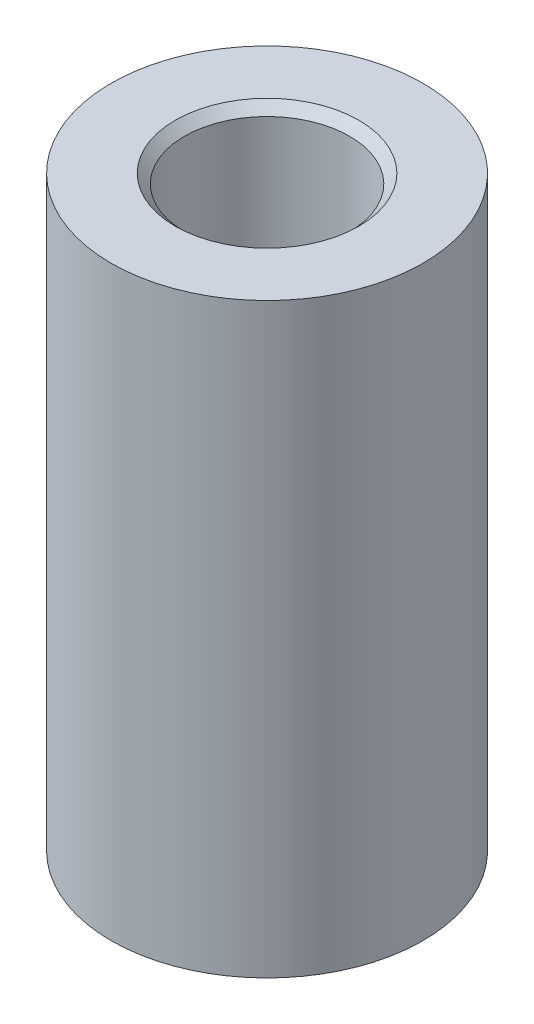
ISO-10303-21;
HEADER;
FILE_DESCRIPTION(('STEP AP214'),'2;1');
FILE_NAME('part.step','',(''),(''),'','','');
FILE_SCHEMA(('AUTOMOTIVE_DESIGN { 1 0 10303 214 1 1 1 1 }'));
ENDSEC;
DATA;
#1=APPLICATION_CONTEXT('core data for automotive mechanical design processes');
#2=APPLICATION_PROTOCOL_DEFINITION('international standard','automotive_design',2000,#1);
#3=PRODUCT_CONTEXT('',#1,'mechanical');
#4=PRODUCT('Part','Part','',(#3));
#5=PRODUCT_RELATED_PRODUCT_CATEGORY('part','',(#4));
#6=PRODUCT_DEFINITION_FORMATION('','',#4);
#7=PRODUCT_DEFINITION_CONTEXT('part definition',#1,'design');
#8=PRODUCT_DEFINITION('design','',#6,#7);
#9=PRODUCT_DEFINITION_SHAPE('','',#8);
#10=(LENGTH_UNIT() NAMED_UNIT(*) SI_UNIT(.MILLI.,.METRE.));
#11=(NAMED_UNIT(*) PLANE_ANGLE_UNIT() SI_UNIT($,.RADIAN.));
#12=(NAMED_UNIT(*) SI_UNIT($,.STERADIAN.) SOLID_ANGLE_UNIT());
#13=UNCERTAINTY_MEASURE_WITH_UNIT(LENGTH_MEASURE(1.E-05),#10,'distance_accuracy_value','');
#14=(GEOMETRIC_REPRESENTATION_CONTEXT(3) GLOBAL_UNCERTAINTY_ASSIGNED_CONTEXT((#13)) GLOBAL_UNIT_ASSIGNED_CONTEXT((#10,
#11,#12)) REPRESENTATION_CONTEXT('',''));
#15=CARTESIAN_POINT('',(0.,0.,0.));
#16=DIRECTION('',(0.,0.,1.));
#17=DIRECTION('',(1.,0.,0.));
#18=AXIS2_PLACEMENT_3D('',#15,#16,#17);
#19=CARTESIAN_POINT('',(-839.144552427114,25.4,-1451.42328364506));
#20=DIRECTION('',(0.,1.,0.));
#21=DIRECTION('',(0.,0.,1.));
#22=AXIS2_PLACEMENT_3D('',#19,#20,#21);
#23=PLANE('',#22);
#24=CARTESIAN_POINT('',(-839.144552427114,25.4,-1451.42328364506));
#25=DIRECTION('',(0.,1.,0.));
#26=DIRECTION('',(0.,0.,1.));
#27=AXIS2_PLACEMENT_3D('',#24,#25,#26);
#28=CIRCLE('',#27,3.97500000000006);
#29=CARTESIAN_POINT('',(-839.144552427114,25.4,-1447.44828364506));
#30=VERTEX_POINT('',#29);
#31=EDGE_CURVE('E10',#30,#30,#28,.F.);
#32=ORIENTED_EDGE('',*,*,#31,.T.);
#33=EDGE_LOOP('',(#32));
#34=FACE_BOUND('',#33,.T.);
#35=CARTESIAN_POINT('',(-839.144552427114,25.4,-1451.42328364506));
#36=DIRECTION('',(0.,1.,0.));
#37=DIRECTION('',(0.,0.,1.));
#38=AXIS2_PLACEMENT_3D('',#35,#36,#37);
#39=CIRCLE('',#38,6.75000000000003);
#40=CARTESIAN_POINT('',(-839.144552427114,25.4,-1444.67328364506));
#41=VERTEX_POINT('',#40);
#42=EDGE_CURVE('E51',#41,#41,#39,.T.);
#43=ORIENTED_EDGE('',*,*,#42,.T.);
#44=EDGE_LOOP('',(#43));
#45=FACE_BOUND('',#44,.T.);
#46=ADVANCED_FACE('F31',(#34,#45),#23,.T.);
#47=CARTESIAN_POINT('',(-839.144552427114,0.,-1451.42328364506));
#48=DIRECTION('',(0.,1.,0.));
#49=DIRECTION('',(0.,0.,1.));
#50=AXIS2_PLACEMENT_3D('',#47,#48,#49);
#51=PLANE('',#50);
#52=CARTESIAN_POINT('',(-839.144552427114,0.,-1451.42328364506));
#53=DIRECTION('',(0.,1.,0.));
#54=DIRECTION('',(0.,0.,1.));
#55=AXIS2_PLACEMENT_3D('',#52,#53,#54);
#56=CIRCLE('',#55,3.97500000000006);
#57=CARTESIAN_POINT('',(-839.144552427114,0.,-1447.44828364506));
#58=VERTEX_POINT('',#57);
#59=EDGE_CURVE('E46',#58,#58,#56,.T.);
#60=ORIENTED_EDGE('',*,*,#59,.T.);
#61=EDGE_LOOP('',(#60));
#62=FACE_BOUND('',#61,.T.);
#63=CARTESIAN_POINT('',(-839.144552427114,0.,-1451.42328364506));
#64=DIRECTION('',(0.,1.,0.));
#65=DIRECTION('',(0.,0.,1.));
#66=AXIS2_PLACEMENT_3D('',#63,#64,#65);
#67=CIRCLE('',#66,6.75000000000003);
#68=CARTESIAN_POINT('',(-839.144552427114,0.,-1444.67328364506));
#69=VERTEX_POINT('',#68);
#70=EDGE_CURVE('E52',#69,#69,#67,.T.);
#71=ORIENTED_EDGE('',*,*,#70,.F.);
#72=EDGE_LOOP('',(#71));
#73=FACE_BOUND('',#72,.T.);
#74=ADVANCED_FACE('F63',(#62,#73),#51,.F.);
#75=CARTESIAN_POINT('',(-839.144552427114,25.4,-1451.42328364506));
#76=DIRECTION('',(0.,-1.,0.));
#77=DIRECTION('',(0.,0.,-1.));
#78=AXIS2_PLACEMENT_3D('',#75,#76,#77);
#79=CYLINDRICAL_SURFACE('',#78,6.75000000000003);
#80=ORIENTED_EDGE('',*,*,#42,.F.);
#81=EDGE_LOOP('',(#80));
#82=FACE_BOUND('',#81,.T.);
#83=ORIENTED_EDGE('',*,*,#70,.T.);
#84=EDGE_LOOP('',(#83));
#85=FACE_BOUND('',#84,.T.);
#86=ADVANCED_FACE('F59',(#82,#85),#79,.T.);
#87=CARTESIAN_POINT('',(-839.144552427114,25.4,-1451.42328364506));
#88=DIRECTION('',(0.,-1.,0.));
#89=DIRECTION('',(0.,0.,-1.));
#90=AXIS2_PLACEMENT_3D('',#87,#88,#89);
#91=CYLINDRICAL_SURFACE('',#90,3.57500000000007);
#92=CARTESIAN_POINT('',(-839.144552427114,0.400000000000008,-1451.42328364506));
#93=DIRECTION('',(0.,1.,0.));
#94=DIRECTION('',(0.,0.,1.));
#95=AXIS2_PLACEMENT_3D('',#92,#93,#94);
#96=CIRCLE('',#95,3.57500000000007);
#97=CARTESIAN_POINT('',(-839.144552427114,0.400000000000008,-1447.84828364506));
#98=VERTEX_POINT('',#97);
#99=EDGE_CURVE('E38',#98,#98,#96,.F.);
#100=ORIENTED_EDGE('',*,*,#99,.T.);
#101=EDGE_LOOP('',(#100));
#102=FACE_BOUND('',#101,.T.);
#103=CARTESIAN_POINT('',(-839.144552427114,24.9999999999999,-1451.42328364506));
#104=DIRECTION('',(0.,1.,0.));
#105=DIRECTION('',(0.,0.,1.));
#106=AXIS2_PLACEMENT_3D('',#103,#104,#105);
#107=CIRCLE('',#106,3.57500000000007);
#108=CARTESIAN_POINT('',(-839.144552427114,24.9999999999999,-1447.84828364506));
#109=VERTEX_POINT('',#108);
#110=EDGE_CURVE('E42',#109,#109,#107,.T.);
#111=ORIENTED_EDGE('',*,*,#110,.T.);
#112=EDGE_LOOP('',(#111));
#113=FACE_BOUND('',#112,.T.);
#114=ADVANCED_FACE('F62',(#102,#113),#91,.F.);
#115=CARTESIAN_POINT('',(-839.144552427114,0.,-1451.42328364506));
#116=DIRECTION('',(0.,-1.,0.));
#117=DIRECTION('',(0.,0.,-1.));
#118=AXIS2_PLACEMENT_3D('',#115,#116,#117);
#119=CONICAL_SURFACE('',#118,3.97500000000006,0.785398163397423);
#120=ORIENTED_EDGE('',*,*,#99,.F.);
#121=EDGE_LOOP('',(#120));
#122=FACE_BOUND('',#121,.T.);
#123=ORIENTED_EDGE('',*,*,#59,.F.);
#124=EDGE_LOOP('',(#123));
#125=FACE_BOUND('',#124,.T.);
#126=ADVANCED_FACE('F75',(#122,#125),#119,.F.);
#127=CARTESIAN_POINT('',(-839.144552427114,24.9999999999999,-1451.42328364506));
#128=DIRECTION('',(0.,1.,0.));
#129=DIRECTION('',(0.,0.,1.));
#130=AXIS2_PLACEMENT_3D('',#127,#128,#129);
#131=CONICAL_SURFACE('',#130,3.57500000000007,0.785398163397323);
#132=CARTESIAN_POINT('',(-839.144552427114,25.4,-1447.44828364506));
#133=CARTESIAN_POINT('',(-839.144552427114,25.3958333333333,-1447.45245031173));
#134=CARTESIAN_POINT('',(-839.144552427114,25.3916666666667,-1447.4566169784));
#135=CARTESIAN_POINT('',(-839.144552427114,25.3833333333333,-1447.46495031173));
#136=CARTESIAN_POINT('',(-839.144552427114,25.3791666666667,-1447.4691169784));
#137=CARTESIAN_POINT('',(-839.144552427114,25.3708333333333,-1447.47745031173));
#138=CARTESIAN_POINT('',(-839.144552427114,25.3666666666666,-1447.4816169784));
#139=CARTESIAN_POINT('',(-839.144552427114,25.3583333333333,-1447.48995031173));
#140=CARTESIAN_POINT('',(-839.144552427114,25.3541666666667,-1447.4941169784));
#141=CARTESIAN_POINT('',(-839.144552427114,25.3458333333333,-1447.50245031173));
#142=CARTESIAN_POINT('',(-839.144552427114,25.3416666666667,-1447.5066169784));
#143=CARTESIAN_POINT('',(-839.144552427114,25.3333333333333,-1447.51495031173));
#144=CARTESIAN_POINT('',(-839.144552427114,25.3291666666666,-1447.5191169784));
#145=CARTESIAN_POINT('',(-839.144552427114,25.3208333333333,-1447.52745031173));
#146=CARTESIAN_POINT('',(-839.144552427114,25.3166666666666,-1447.5316169784));
#147=CARTESIAN_POINT('',(-839.144552427114,25.3083333333333,-1447.53995031173));
#148=CARTESIAN_POINT('',(-839.144552427114,25.3041666666666,-1447.5441169784));
#149=CARTESIAN_POINT('',(-839.144552427114,25.2958333333333,-1447.55245031173));
#150=CARTESIAN_POINT('',(-839.144552427114,25.2916666666666,-1447.5566169784));
#151=CARTESIAN_POINT('',(-839.144552427114,25.2833333333333,-1447.56495031173));
#152=CARTESIAN_POINT('',(-839.144552427114,25.2791666666666,-1447.5691169784));
#153=CARTESIAN_POINT('',(-839.144552427114,25.2708333333333,-1447.57745031173));
#154=CARTESIAN_POINT('',(-839.144552427114,25.2666666666666,-1447.5816169784));
#155=CARTESIAN_POINT('',(-839.144552427114,25.2583333333333,-1447.58995031173));
#156=CARTESIAN_POINT('',(-839.144552427114,25.2541666666666,-1447.5941169784));
#157=CARTESIAN_POINT('',(-839.144552427114,25.2458333333333,-1447.60245031173));
#158=CARTESIAN_POINT('',(-839.144552427114,25.2416666666666,-1447.6066169784));
#159=CARTESIAN_POINT('',(-839.144552427114,25.2333333333333,-1447.61495031173));
#160=CARTESIAN_POINT('',(-839.144552427114,25.2291666666666,-1447.6191169784));
#161=CARTESIAN_POINT('',(-839.144552427114,25.2208333333333,-1447.62745031173));
#162=CARTESIAN_POINT('',(-839.144552427114,25.2166666666666,-1447.6316169784));
#163=CARTESIAN_POINT('',(-839.144552427114,25.2083333333333,-1447.63995031173));
#164=CARTESIAN_POINT('',(-839.144552427114,25.2041666666666,-1447.6441169784));
#165=CARTESIAN_POINT('',(-839.144552427114,25.1958333333333,-1447.65245031173));
#166=CARTESIAN_POINT('',(-839.144552427114,25.1916666666666,-1447.6566169784));
#167=CARTESIAN_POINT('',(-839.144552427114,25.1833333333333,-1447.66495031173));
#168=CARTESIAN_POINT('',(-839.144552427114,25.1791666666666,-1447.6691169784));
#169=CARTESIAN_POINT('',(-839.144552427114,25.1708333333333,-1447.67745031173));
#170=CARTESIAN_POINT('',(-839.144552427114,25.1666666666666,-1447.6816169784));
#171=CARTESIAN_POINT('',(-839.144552427114,25.1583333333333,-1447.68995031173));
#172=CARTESIAN_POINT('',(-839.144552427114,25.1541666666666,-1447.6941169784));
#173=CARTESIAN_POINT('',(-839.144552427114,25.1458333333333,-1447.70245031173));
#174=CARTESIAN_POINT('',(-839.144552427114,25.1416666666666,-1447.7066169784));
#175=CARTESIAN_POINT('',(-839.144552427114,25.1333333333333,-1447.71495031173));
#176=CARTESIAN_POINT('',(-839.144552427114,25.1291666666666,-1447.7191169784));
#177=CARTESIAN_POINT('',(-839.144552427114,25.1208333333333,-1447.72745031173));
#178=CARTESIAN_POINT('',(-839.144552427114,25.1166666666666,-1447.7316169784));
#179=CARTESIAN_POINT('',(-839.144552427114,25.1083333333333,-1447.73995031173));
#180=CARTESIAN_POINT('',(-839.144552427114,25.1041666666666,-1447.7441169784));
#181=CARTESIAN_POINT('',(-839.144552427114,25.0958333333333,-1447.75245031173));
#182=CARTESIAN_POINT('',(-839.144552427114,25.0916666666666,-1447.7566169784));
#183=CARTESIAN_POINT('',(-839.144552427114,25.0833333333333,-1447.76495031173));
#184=CARTESIAN_POINT('',(-839.144552427114,25.0791666666666,-1447.7691169784));
#185=CARTESIAN_POINT('',(-839.144552427114,25.0708333333332,-1447.77745031173));
#186=CARTESIAN_POINT('',(-839.144552427114,25.0666666666666,-1447.7816169784));
#187=CARTESIAN_POINT('',(-839.144552427114,25.0583333333333,-1447.78995031173));
#188=CARTESIAN_POINT('',(-839.144552427114,25.0541666666666,-1447.7941169784));
#189=CARTESIAN_POINT('',(-839.144552427114,25.0458333333332,-1447.80245031173));
#190=CARTESIAN_POINT('',(-839.144552427114,25.0416666666666,-1447.8066169784));
#191=CARTESIAN_POINT('',(-839.144552427114,25.0333333333332,-1447.81495031173));
#192=CARTESIAN_POINT('',(-839.144552427114,25.0291666666666,-1447.8191169784));
#193=CARTESIAN_POINT('',(-839.144552427114,25.0208333333333,-1447.82745031173));
#194=CARTESIAN_POINT('',(-839.144552427114,25.0166666666666,-1447.8316169784));
#195=CARTESIAN_POINT('',(-839.144552427114,25.0083333333332,-1447.83995031173));
#196=CARTESIAN_POINT('',(-839.144552427114,25.0041666666666,-1447.8441169784));
#197=CARTESIAN_POINT('',(-839.144552427114,24.9999999999999,-1447.84828364506));
#198=B_SPLINE_CURVE_WITH_KNOTS('',3,(#132,#133,#134,#135,#136,#137,#138,#139,#140,#141,#142,
#143,#144,#145,#146,#147,#148,#149,#150,#151,#152,#153,#154,#155,#156,#157,#158,#159,#160,#161,
#162,#163,#164,#165,#166,#167,#168,#169,#170,#171,#172,#173,#174,#175,#176,#177,#178,#179,#180,
#181,#182,#183,#184,#185,#186,#187,#188,#189,#190,#191,#192,#193,#194,#195,#196,#197),
.UNSPECIFIED.,.F.,.F.,(4,2,2,2,2,2,2,2,2,2,2,2,2,2,2,2,2,2,2,2,2,2,2,2,2,2,2,2,2,2,2,2,4),(0.,
0.0176776695296446,0.0353553390592891,0.0530330085889337,0.0707106781187353,0.0883883476483798,
0.106066017178027,0.123743686707671,0.141421356237316,0.159099025766961,0.176776695296605,
0.194454364826252,0.212132034356054,0.229809703885698,0.247487373415343,0.265165042944987,
0.282842712474634,0.300520382004279,0.318198051533924,0.335875721063568,0.35355339059337,
0.371231060123014,0.388908729652661,0.406586399182306,0.42426406871195,0.441941738241595,
0.45961940777124,0.477297077301044,0.494974746830688,0.512652416360333,0.530330085889977,
0.548007755419622,0.565685424949266),.UNSPECIFIED.);
#199=EDGE_CURVE('BSEAM33',#30,#109,#198,.T.);
#200=ORIENTED_EDGE('',*,*,#31,.F.);
#201=ORIENTED_EDGE('',*,*,#110,.F.);
#202=ORIENTED_EDGE('',*,*,#199,.T.);
#203=ORIENTED_EDGE('',*,*,#199,.F.);
#204=EDGE_LOOP('',(#200,#202,#201,#203));
#205=FACE_BOUND('',#204,.T.);
#206=ADVANCED_FACE('F33',(#205),#131,.F.);
#207=CLOSED_SHELL('',(#46,#74,#86,#114,#126,#206));
#208=MANIFOLD_SOLID_BREP('B2',#207);
#209=ADVANCED_BREP_SHAPE_REPRESENTATION('',(#18,#208),#14);
#210=SHAPE_DEFINITION_REPRESENTATION(#9,#209);
ENDSEC;
END-ISO-10303-21;
